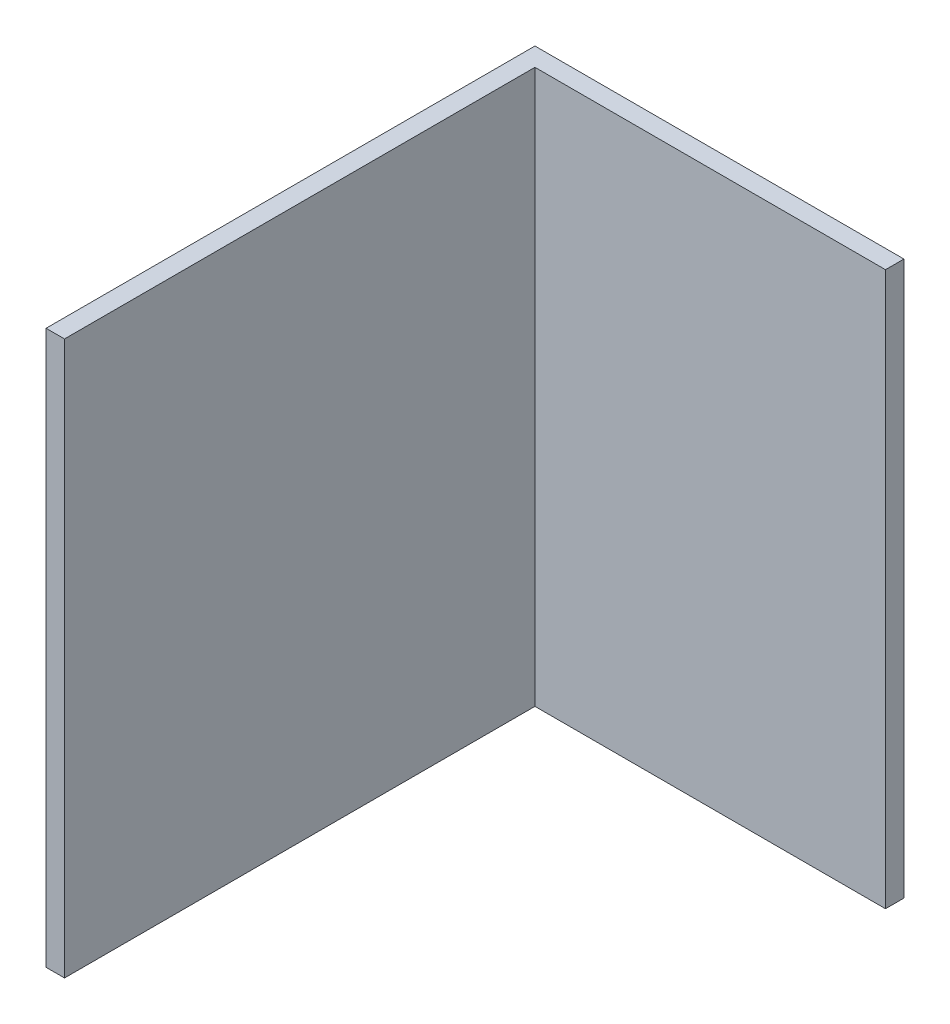
ISO-10303-21;
HEADER;
FILE_DESCRIPTION(('STEP AP214'),'2;1');
FILE_NAME('part.step','',(''),(''),'','','');
FILE_SCHEMA(('AUTOMOTIVE_DESIGN { 1 0 10303 214 1 1 1 1 }'));
ENDSEC;
DATA;
#1=APPLICATION_CONTEXT('core data for automotive mechanical design processes');
#2=APPLICATION_PROTOCOL_DEFINITION('international standard','automotive_design',2000,#1);
#3=PRODUCT_CONTEXT('',#1,'mechanical');
#4=PRODUCT('Part','Part','',(#3));
#5=PRODUCT_RELATED_PRODUCT_CATEGORY('part','',(#4));
#6=PRODUCT_DEFINITION_FORMATION('','',#4);
#7=PRODUCT_DEFINITION_CONTEXT('part definition',#1,'design');
#8=PRODUCT_DEFINITION('design','',#6,#7);
#9=PRODUCT_DEFINITION_SHAPE('','',#8);
#10=(LENGTH_UNIT() NAMED_UNIT(*) SI_UNIT(.MILLI.,.METRE.));
#11=(NAMED_UNIT(*) PLANE_ANGLE_UNIT() SI_UNIT($,.RADIAN.));
#12=(NAMED_UNIT(*) SI_UNIT($,.STERADIAN.) SOLID_ANGLE_UNIT());
#13=UNCERTAINTY_MEASURE_WITH_UNIT(LENGTH_MEASURE(1.E-05),#10,'distance_accuracy_value','');
#14=(GEOMETRIC_REPRESENTATION_CONTEXT(3) GLOBAL_UNCERTAINTY_ASSIGNED_CONTEXT((#13)) GLOBAL_UNIT_ASSIGNED_CONTEXT((#10,
#11,#12)) REPRESENTATION_CONTEXT('',''));
#15=CARTESIAN_POINT('',(0.,0.,0.));
#16=DIRECTION('',(0.,0.,1.));
#17=DIRECTION('',(1.,0.,0.));
#18=AXIS2_PLACEMENT_3D('',#15,#16,#17);
#19=CARTESIAN_POINT('',(200.,300.,0.));
#20=DIRECTION('',(0.,0.,1.));
#21=DIRECTION('',(1.,0.,0.));
#22=AXIS2_PLACEMENT_3D('',#19,#20,#21);
#23=PLANE('',#22);
#24=DIRECTION('',(-1.,0.,0.));
#25=VECTOR('',#24,1.);
#26=CARTESIAN_POINT('',(200.,0.,0.));
#27=LINE('',#26,#25);
#28=CARTESIAN_POINT('',(200.,0.,0.));
#29=VERTEX_POINT('',#28);
#30=CARTESIAN_POINT('',(0.,0.,0.));
#31=VERTEX_POINT('',#30);
#32=EDGE_CURVE('E128',#29,#31,#27,.T.);
#33=ORIENTED_EDGE('',*,*,#32,.T.);
#34=DIRECTION('',(0.,-1.,0.));
#35=VECTOR('',#34,1.);
#36=CARTESIAN_POINT('',(0.,300.,0.));
#37=LINE('',#36,#35);
#38=CARTESIAN_POINT('',(0.,300.,0.));
#39=VERTEX_POINT('',#38);
#40=EDGE_CURVE('E11',#39,#31,#37,.T.);
#41=ORIENTED_EDGE('',*,*,#40,.F.);
#42=DIRECTION('',(-1.,0.,0.));
#43=VECTOR('',#42,1.);
#44=CARTESIAN_POINT('',(200.,300.,0.));
#45=LINE('',#44,#43);
#46=CARTESIAN_POINT('',(200.,300.,0.));
#47=VERTEX_POINT('',#46);
#48=EDGE_CURVE('E144',#47,#39,#45,.T.);
#49=ORIENTED_EDGE('',*,*,#48,.F.);
#50=DIRECTION('',(0.,-1.,0.));
#51=VECTOR('',#50,1.);
#52=CARTESIAN_POINT('',(200.,300.,0.));
#53=LINE('',#52,#51);
#54=EDGE_CURVE('E124',#47,#29,#53,.T.);
#55=ORIENTED_EDGE('',*,*,#54,.T.);
#56=EDGE_LOOP('',(#33,#41,#49,#55));
#57=FACE_BOUND('',#56,.T.);
#58=ADVANCED_FACE('F39',(#57),#23,.F.);
#59=CARTESIAN_POINT('',(0.,300.,0.));
#60=DIRECTION('',(1.,0.,0.));
#61=DIRECTION('',(0.,0.,-1.));
#62=AXIS2_PLACEMENT_3D('',#59,#60,#61);
#63=PLANE('',#62);
#64=DIRECTION('',(0.,0.,1.));
#65=VECTOR('',#64,1.);
#66=CARTESIAN_POINT('',(0.,0.,0.));
#67=LINE('',#66,#65);
#68=CARTESIAN_POINT('',(0.,0.,265.));
#69=VERTEX_POINT('',#68);
#70=EDGE_CURVE('E132',#31,#69,#67,.T.);
#71=ORIENTED_EDGE('',*,*,#70,.T.);
#72=DIRECTION('',(0.,-1.,0.));
#73=VECTOR('',#72,1.);
#74=CARTESIAN_POINT('',(0.,300.,265.));
#75=LINE('',#74,#73);
#76=CARTESIAN_POINT('',(0.,300.,265.));
#77=VERTEX_POINT('',#76);
#78=EDGE_CURVE('E48',#77,#69,#75,.T.);
#79=ORIENTED_EDGE('',*,*,#78,.F.);
#80=DIRECTION('',(0.,0.,1.));
#81=VECTOR('',#80,1.);
#82=CARTESIAN_POINT('',(0.,300.,0.));
#83=LINE('',#82,#81);
#84=EDGE_CURVE('E93',#39,#77,#83,.T.);
#85=ORIENTED_EDGE('',*,*,#84,.F.);
#86=ORIENTED_EDGE('',*,*,#40,.T.);
#87=EDGE_LOOP('',(#71,#79,#85,#86));
#88=FACE_BOUND('',#87,.T.);
#89=ADVANCED_FACE('F172',(#88),#63,.F.);
#90=CARTESIAN_POINT('',(0.,300.,265.));
#91=DIRECTION('',(0.,0.,-1.));
#92=DIRECTION('',(-1.,0.,0.));
#93=AXIS2_PLACEMENT_3D('',#90,#91,#92);
#94=PLANE('',#93);
#95=DIRECTION('',(1.,0.,0.));
#96=VECTOR('',#95,1.);
#97=CARTESIAN_POINT('',(0.,0.,265.));
#98=LINE('',#97,#96);
#99=CARTESIAN_POINT('',(10.,0.,265.));
#100=VERTEX_POINT('',#99);
#101=EDGE_CURVE('E135',#69,#100,#98,.T.);
#102=ORIENTED_EDGE('',*,*,#101,.T.);
#103=DIRECTION('',(0.,-1.,0.));
#104=VECTOR('',#103,1.);
#105=CARTESIAN_POINT('',(10.,300.,265.));
#106=LINE('',#105,#104);
#107=CARTESIAN_POINT('',(10.,300.,265.));
#108=VERTEX_POINT('',#107);
#109=EDGE_CURVE('E117',#108,#100,#106,.T.);
#110=ORIENTED_EDGE('',*,*,#109,.F.);
#111=DIRECTION('',(1.,0.,0.));
#112=VECTOR('',#111,1.);
#113=CARTESIAN_POINT('',(0.,300.,265.));
#114=LINE('',#113,#112);
#115=EDGE_CURVE('E106',#77,#108,#114,.T.);
#116=ORIENTED_EDGE('',*,*,#115,.F.);
#117=ORIENTED_EDGE('',*,*,#78,.T.);
#118=EDGE_LOOP('',(#102,#110,#116,#117));
#119=FACE_BOUND('',#118,.T.);
#120=ADVANCED_FACE('F154',(#119),#94,.F.);
#121=CARTESIAN_POINT('',(10.,300.,265.));
#122=DIRECTION('',(-1.,0.,0.));
#123=DIRECTION('',(0.,0.,1.));
#124=AXIS2_PLACEMENT_3D('',#121,#122,#123);
#125=PLANE('',#124);
#126=DIRECTION('',(0.,0.,-1.));
#127=VECTOR('',#126,1.);
#128=CARTESIAN_POINT('',(10.,0.,265.));
#129=LINE('',#128,#127);
#130=CARTESIAN_POINT('',(10.,0.,10.));
#131=VERTEX_POINT('',#130);
#132=EDGE_CURVE('E115',#100,#131,#129,.T.);
#133=ORIENTED_EDGE('',*,*,#132,.T.);
#134=DIRECTION('',(0.,-1.,0.));
#135=VECTOR('',#134,1.);
#136=CARTESIAN_POINT('',(10.,300.,10.));
#137=LINE('',#136,#135);
#138=CARTESIAN_POINT('',(10.,300.,10.));
#139=VERTEX_POINT('',#138);
#140=EDGE_CURVE('E112',#139,#131,#137,.T.);
#141=ORIENTED_EDGE('',*,*,#140,.F.);
#142=DIRECTION('',(0.,0.,-1.));
#143=VECTOR('',#142,1.);
#144=CARTESIAN_POINT('',(10.,300.,265.));
#145=LINE('',#144,#143);
#146=EDGE_CURVE('E100',#108,#139,#145,.T.);
#147=ORIENTED_EDGE('',*,*,#146,.F.);
#148=ORIENTED_EDGE('',*,*,#109,.T.);
#149=EDGE_LOOP('',(#133,#141,#147,#148));
#150=FACE_BOUND('',#149,.T.);
#151=ADVANCED_FACE('F113',(#150),#125,.F.);
#152=CARTESIAN_POINT('',(10.,300.,10.));
#153=DIRECTION('',(0.,0.,-1.));
#154=DIRECTION('',(-1.,0.,0.));
#155=AXIS2_PLACEMENT_3D('',#152,#153,#154);
#156=PLANE('',#155);
#157=DIRECTION('',(1.,0.,0.));
#158=VECTOR('',#157,1.);
#159=CARTESIAN_POINT('',(10.,0.,10.));
#160=LINE('',#159,#158);
#161=CARTESIAN_POINT('',(200.,0.,10.));
#162=VERTEX_POINT('',#161);
#163=EDGE_CURVE('E79',#131,#162,#160,.T.);
#164=ORIENTED_EDGE('',*,*,#163,.T.);
#165=DIRECTION('',(0.,-1.,0.));
#166=VECTOR('',#165,1.);
#167=CARTESIAN_POINT('',(200.,300.,10.));
#168=LINE('',#167,#166);
#169=CARTESIAN_POINT('',(200.,300.,10.));
#170=VERTEX_POINT('',#169);
#171=EDGE_CURVE('E118',#170,#162,#168,.T.);
#172=ORIENTED_EDGE('',*,*,#171,.F.);
#173=DIRECTION('',(1.,0.,0.));
#174=VECTOR('',#173,1.);
#175=CARTESIAN_POINT('',(10.,300.,10.));
#176=LINE('',#175,#174);
#177=EDGE_CURVE('E104',#139,#170,#176,.T.);
#178=ORIENTED_EDGE('',*,*,#177,.F.);
#179=ORIENTED_EDGE('',*,*,#140,.T.);
#180=EDGE_LOOP('',(#164,#172,#178,#179));
#181=FACE_BOUND('',#180,.T.);
#182=ADVANCED_FACE('F120',(#181),#156,.F.);
#183=CARTESIAN_POINT('',(200.,300.,10.));
#184=DIRECTION('',(-1.,0.,0.));
#185=DIRECTION('',(0.,0.,1.));
#186=AXIS2_PLACEMENT_3D('',#183,#184,#185);
#187=PLANE('',#186);
#188=DIRECTION('',(0.,0.,-1.));
#189=VECTOR('',#188,1.);
#190=CARTESIAN_POINT('',(200.,0.,10.));
#191=LINE('',#190,#189);
#192=EDGE_CURVE('E85',#162,#29,#191,.T.);
#193=ORIENTED_EDGE('',*,*,#192,.T.);
#194=ORIENTED_EDGE('',*,*,#54,.F.);
#195=DIRECTION('',(0.,0.,-1.));
#196=VECTOR('',#195,1.);
#197=CARTESIAN_POINT('',(200.,300.,10.));
#198=LINE('',#197,#196);
#199=EDGE_CURVE('E56',#170,#47,#198,.T.);
#200=ORIENTED_EDGE('',*,*,#199,.F.);
#201=ORIENTED_EDGE('',*,*,#171,.T.);
#202=EDGE_LOOP('',(#193,#194,#200,#201));
#203=FACE_BOUND('',#202,.T.);
#204=ADVANCED_FACE('F161',(#203),#187,.F.);
#205=CARTESIAN_POINT('',(0.,300.,0.));
#206=DIRECTION('',(0.,1.,0.));
#207=DIRECTION('',(0.,0.,1.));
#208=AXIS2_PLACEMENT_3D('',#205,#206,#207);
#209=PLANE('',#208);
#210=ORIENTED_EDGE('',*,*,#48,.T.);
#211=ORIENTED_EDGE('',*,*,#84,.T.);
#212=ORIENTED_EDGE('',*,*,#115,.T.);
#213=ORIENTED_EDGE('',*,*,#146,.T.);
#214=ORIENTED_EDGE('',*,*,#177,.T.);
#215=ORIENTED_EDGE('',*,*,#199,.T.);
#216=EDGE_LOOP('',(#210,#211,#212,#213,#214,#215));
#217=FACE_BOUND('',#216,.T.);
#218=ADVANCED_FACE('F102',(#217),#209,.T.);
#219=CARTESIAN_POINT('',(0.,0.,0.));
#220=DIRECTION('',(0.,1.,0.));
#221=DIRECTION('',(0.,0.,1.));
#222=AXIS2_PLACEMENT_3D('',#219,#220,#221);
#223=PLANE('',#222);
#224=ORIENTED_EDGE('',*,*,#32,.F.);
#225=ORIENTED_EDGE('',*,*,#192,.F.);
#226=ORIENTED_EDGE('',*,*,#163,.F.);
#227=ORIENTED_EDGE('',*,*,#132,.F.);
#228=ORIENTED_EDGE('',*,*,#101,.F.);
#229=ORIENTED_EDGE('',*,*,#70,.F.);
#230=EDGE_LOOP('',(#224,#225,#226,#227,#228,#229));
#231=FACE_BOUND('',#230,.T.);
#232=ADVANCED_FACE('F157',(#231),#223,.F.);
#233=CLOSED_SHELL('',(#58,#89,#120,#151,#182,#204,#218,#232));
#234=MANIFOLD_SOLID_BREP('B2',#233);
#235=ADVANCED_BREP_SHAPE_REPRESENTATION('',(#18,#234),#14);
#236=SHAPE_DEFINITION_REPRESENTATION(#9,#235);
ENDSEC;
END-ISO-10303-21;
